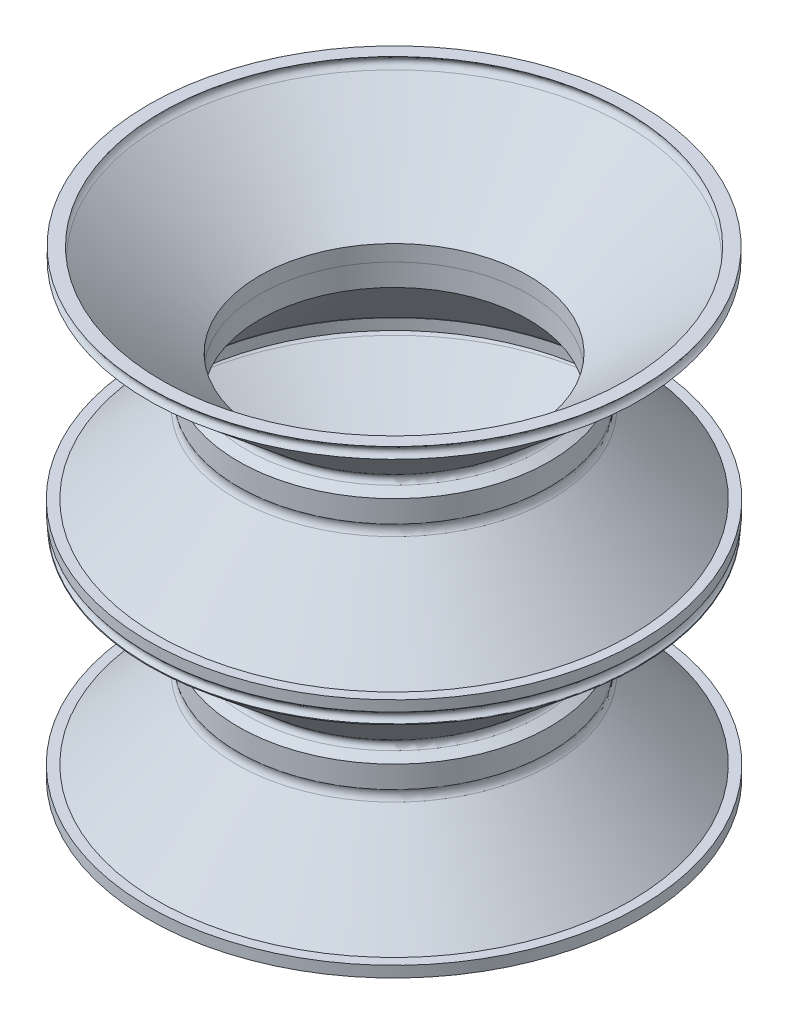
ISO-10303-21;
HEADER;
FILE_DESCRIPTION(('STEP AP214'),'2;1');
FILE_NAME('part.step','',(''),(''),'','','');
FILE_SCHEMA(('AUTOMOTIVE_DESIGN { 1 0 10303 214 1 1 1 1 }'));
ENDSEC;
DATA;
#1=APPLICATION_CONTEXT('core data for automotive mechanical design processes');
#2=APPLICATION_PROTOCOL_DEFINITION('international standard','automotive_design',2000,#1);
#3=PRODUCT_CONTEXT('',#1,'mechanical');
#4=PRODUCT('Part','Part','',(#3));
#5=PRODUCT_RELATED_PRODUCT_CATEGORY('part','',(#4));
#6=PRODUCT_DEFINITION_FORMATION('','',#4);
#7=PRODUCT_DEFINITION_CONTEXT('part definition',#1,'design');
#8=PRODUCT_DEFINITION('design','',#6,#7);
#9=PRODUCT_DEFINITION_SHAPE('','',#8);
#10=(LENGTH_UNIT() NAMED_UNIT(*) SI_UNIT(.MILLI.,.METRE.));
#11=(NAMED_UNIT(*) PLANE_ANGLE_UNIT() SI_UNIT($,.RADIAN.));
#12=(NAMED_UNIT(*) SI_UNIT($,.STERADIAN.) SOLID_ANGLE_UNIT());
#13=UNCERTAINTY_MEASURE_WITH_UNIT(LENGTH_MEASURE(1.E-05),#10,'distance_accuracy_value','');
#14=(GEOMETRIC_REPRESENTATION_CONTEXT(3) GLOBAL_UNCERTAINTY_ASSIGNED_CONTEXT((#13)) GLOBAL_UNIT_ASSIGNED_CONTEXT((#10,
#11,#12)) REPRESENTATION_CONTEXT('',''));
#15=CARTESIAN_POINT('',(0.,0.,0.));
#16=DIRECTION('',(0.,0.,1.));
#17=DIRECTION('',(1.,0.,0.));
#18=AXIS2_PLACEMENT_3D('',#15,#16,#17);
#19=CARTESIAN_POINT('',(12.266246150267,20.84,0.));
#20=DIRECTION('',(0.,-1.,0.));
#21=DIRECTION('',(1.,0.,0.));
#22=AXIS2_PLACEMENT_3D('',#19,#20,#21);
#23=CONICAL_SURFACE('',#22,12.7105503207346,1.02390555454664);
#24=CARTESIAN_POINT('',(12.266246150267,20.4777114557299,0.));
#25=DIRECTION('',(0.,-1.,0.));
#26=DIRECTION('',(1.,0.,0.));
#27=AXIS2_PLACEMENT_3D('',#24,#25,#26);
#28=CIRCLE('',#27,13.3056020683309);
#29=CARTESIAN_POINT('',(25.5718482185979,20.4777114557299,0.));
#30=VERTEX_POINT('',#29);
#31=EDGE_CURVE('E11',#30,#30,#28,.T.);
#32=ORIENTED_EDGE('',*,*,#31,.T.);
#33=EDGE_LOOP('',(#32));
#34=FACE_BOUND('',#33,.T.);
#35=CARTESIAN_POINT('',(12.266246150267,19.9918152658715,0.));
#36=DIRECTION('',(0.,1.,0.));
#37=DIRECTION('',(-1.,0.,0.));
#38=AXIS2_PLACEMENT_3D('',#35,#36,#37);
#39=CIRCLE('',#38,14.1036769219207);
#40=CARTESIAN_POINT('',(-1.83743077165368,19.9918152658715,0.));
#41=VERTEX_POINT('',#40);
#42=EDGE_CURVE('E77',#41,#41,#39,.T.);
#43=ORIENTED_EDGE('',*,*,#42,.T.);
#44=EDGE_LOOP('',(#43));
#45=FACE_BOUND('',#44,.T.);
#46=ADVANCED_FACE('F54',(#34,#45),#23,.T.);
#47=CARTESIAN_POINT('',(12.266246150267,28.84,0.));
#48=DIRECTION('',(0.,1.,0.));
#49=DIRECTION('',(-1.,0.,0.));
#50=AXIS2_PLACEMENT_3D('',#47,#48,#49);
#51=CONICAL_SURFACE('',#50,22.2445790614883,0.87266462599717);
#52=CARTESIAN_POINT('',(12.266246150267,21.2878064534284,0.));
#53=DIRECTION('',(0.,1.,0.));
#54=DIRECTION('',(-1.,0.,0.));
#55=AXIS2_PLACEMENT_3D('',#52,#53,#54);
#56=CIRCLE('',#55,13.2442252703947);
#57=CARTESIAN_POINT('',(-0.977979120127719,21.2878064534284,0.));
#58=VERTEX_POINT('',#57);
#59=EDGE_CURVE('E61',#58,#58,#56,.T.);
#60=ORIENTED_EDGE('',*,*,#59,.T.);
#61=EDGE_LOOP('',(#60));
#62=FACE_BOUND('',#61,.T.);
#63=CARTESIAN_POINT('',(12.266246150267,28.84,0.));
#64=DIRECTION('',(0.,1.,0.));
#65=DIRECTION('',(-1.,0.,0.));
#66=AXIS2_PLACEMENT_3D('',#63,#64,#65);
#67=CIRCLE('',#66,22.2445790614883);
#68=CARTESIAN_POINT('',(-9.97833291122136,28.84,0.));
#69=VERTEX_POINT('',#68);
#70=EDGE_CURVE('E65',#69,#69,#67,.T.);
#71=ORIENTED_EDGE('',*,*,#70,.F.);
#72=EDGE_LOOP('',(#71));
#73=FACE_BOUND('',#72,.T.);
#74=ADVANCED_FACE('F123',(#62,#73),#51,.T.);
#75=CARTESIAN_POINT('',(12.266246150267,21.4397502558786,0.));
#76=DIRECTION('',(0.,1.,0.));
#77=DIRECTION('',(-1.,0.,0.));
#78=AXIS2_PLACEMENT_3D('',#75,#76,#77);
#79=CONICAL_SURFACE('',#78,12.1807257813488,0.87266462599717);
#80=CARTESIAN_POINT('',(12.266246150267,28.84,0.));
#81=DIRECTION('',(0.,-1.,0.));
#82=DIRECTION('',(1.,0.,0.));
#83=AXIS2_PLACEMENT_3D('',#80,#81,#82);
#84=CIRCLE('',#83,21.);
#85=CARTESIAN_POINT('',(33.266246150267,28.84,0.));
#86=VERTEX_POINT('',#85);
#87=EDGE_CURVE('E86',#86,#86,#84,.T.);
#88=ORIENTED_EDGE('',*,*,#87,.F.);
#89=EDGE_LOOP('',(#88));
#90=FACE_BOUND('',#89,.T.);
#91=CARTESIAN_POINT('',(12.266246150267,21.4397502558786,0.));
#92=DIRECTION('',(0.,1.,0.));
#93=DIRECTION('',(-1.,0.,0.));
#94=AXIS2_PLACEMENT_3D('',#91,#92,#93);
#95=CIRCLE('',#94,12.1807257813488);
#96=CARTESIAN_POINT('',(0.0855203689181672,21.4397502558786,0.));
#97=VERTEX_POINT('',#96);
#98=EDGE_CURVE('E69',#97,#97,#95,.T.);
#99=ORIENTED_EDGE('',*,*,#98,.F.);
#100=EDGE_LOOP('',(#99));
#101=FACE_BOUND('',#100,.T.);
#102=ADVANCED_FACE('F119',(#90,#101),#79,.F.);
#103=CARTESIAN_POINT('',(12.266246150267,28.4490180328199,0.));
#104=DIRECTION('',(0.,1.,0.));
#105=DIRECTION('',(-1.,0.,0.));
#106=AXIS2_PLACEMENT_3D('',#103,#104,#105);
#107=CYLINDRICAL_SURFACE('',#106,12.1807257813488);
#108=ORIENTED_EDGE('',*,*,#98,.T.);
#109=EDGE_LOOP('',(#108));
#110=FACE_BOUND('',#109,.T.);
#111=CARTESIAN_POINT('',(12.266246150267,19.9918152658715,0.));
#112=DIRECTION('',(0.,1.,0.));
#113=DIRECTION('',(-1.,0.,0.));
#114=AXIS2_PLACEMENT_3D('',#111,#112,#113);
#115=CIRCLE('',#114,12.1807257813488);
#116=CARTESIAN_POINT('',(0.0855203689181672,19.9918152658715,0.));
#117=VERTEX_POINT('',#116);
#118=EDGE_CURVE('E74',#117,#117,#115,.T.);
#119=ORIENTED_EDGE('',*,*,#118,.F.);
#120=EDGE_LOOP('',(#119));
#121=FACE_BOUND('',#120,.T.);
#122=ADVANCED_FACE('F115',(#110,#121),#107,.F.);
#123=CARTESIAN_POINT('',(0.0855203689181681,19.9918152658715,0.));
#124=DIRECTION('',(0.,-1.,0.));
#125=DIRECTION('',(1.,0.,0.));
#126=AXIS2_PLACEMENT_3D('',#123,#124,#125);
#127=PLANE('',#126);
#128=ORIENTED_EDGE('',*,*,#118,.T.);
#129=EDGE_LOOP('',(#128));
#130=FACE_BOUND('',#129,.T.);
#131=ORIENTED_EDGE('',*,*,#42,.F.);
#132=EDGE_LOOP('',(#131));
#133=FACE_BOUND('',#132,.T.);
#134=ADVANCED_FACE('F112',(#130,#133),#127,.T.);
#135=CARTESIAN_POINT('',(12.266246150267,20.9047842318689,0.));
#136=DIRECTION('',(0.,1.,0.));
#137=DIRECTION('',(-1.,0.,0.));
#138=AXIS2_PLACEMENT_3D('',#135,#136,#137);
#139=TOROIDAL_SURFACE('',#138,13.565619075238,0.5);
#140=ORIENTED_EDGE('',*,*,#31,.F.);
#141=EDGE_LOOP('',(#140));
#142=FACE_BOUND('',#141,.T.);
#143=ORIENTED_EDGE('',*,*,#59,.F.);
#144=EDGE_LOOP('',(#143));
#145=FACE_BOUND('',#144,.T.);
#146=ADVANCED_FACE('F56',(#142,#145),#139,.F.);
#147=CARTESIAN_POINT('',(-8.73375384973302,28.84,0.));
#148=CARTESIAN_POINT('',(-9.41713424360817,29.2947580248928,0.));
#149=CARTESIAN_POINT('',(-8.79657882871846,29.84,0.));
#150=B_SPLINE_CURVE_WITH_KNOTS('',2,(#147,#148,#149),.UNSPECIFIED.,.F.,.F.,(3,3),(0.,1.),.UNSPECIFIED.);
#151=CARTESIAN_POINT('',(12.266246150267,0.870155669747817,0.));
#152=DIRECTION('',(0.,-1.,0.));
#153=AXIS1_PLACEMENT('',#151,#152);
#154=SURFACE_OF_REVOLUTION('',#150,#153);
#155=CARTESIAN_POINT('',(12.266246150267,29.84,0.));
#156=DIRECTION('',(0.,-1.,0.));
#157=DIRECTION('',(1.,0.,0.));
#158=AXIS2_PLACEMENT_3D('',#155,#156,#157);
#159=CIRCLE('',#158,21.0628249789854);
#160=CARTESIAN_POINT('',(33.3290711292524,29.84,0.));
#161=VERTEX_POINT('',#160);
#162=EDGE_CURVE('E80',#161,#161,#159,.T.);
#163=ORIENTED_EDGE('',*,*,#162,.F.);
#164=EDGE_LOOP('',(#163));
#165=FACE_BOUND('',#164,.T.);
#166=ORIENTED_EDGE('',*,*,#87,.T.);
#167=EDGE_LOOP('',(#166));
#168=FACE_BOUND('',#167,.T.);
#169=ADVANCED_FACE('F107',(#165,#168),#154,.T.);
#170=CARTESIAN_POINT('',(-8.79657882871846,29.84,0.));
#171=DIRECTION('',(0.,-1.,0.));
#172=DIRECTION('',(1.,0.,0.));
#173=AXIS2_PLACEMENT_3D('',#170,#171,#172);
#174=PLANE('',#173);
#175=CARTESIAN_POINT('',(12.266246150267,29.84,0.));
#176=DIRECTION('',(0.,-1.,0.));
#177=DIRECTION('',(1.,0.,0.));
#178=AXIS2_PLACEMENT_3D('',#175,#176,#177);
#179=CIRCLE('',#178,22.2445790614883);
#180=CARTESIAN_POINT('',(34.5108252117553,29.84,0.));
#181=VERTEX_POINT('',#180);
#182=EDGE_CURVE('E83',#181,#181,#179,.T.);
#183=ORIENTED_EDGE('',*,*,#182,.F.);
#184=EDGE_LOOP('',(#183));
#185=FACE_BOUND('',#184,.T.);
#186=ORIENTED_EDGE('',*,*,#162,.T.);
#187=EDGE_LOOP('',(#186));
#188=FACE_BOUND('',#187,.T.);
#189=ADVANCED_FACE('F103',(#185,#188),#174,.F.);
#190=CARTESIAN_POINT('',(-9.97833291122136,29.84,0.));
#191=CARTESIAN_POINT('',(-9.32229251414753,29.3233569168223,0.));
#192=CARTESIAN_POINT('',(-9.97833291122136,28.84,0.));
#193=B_SPLINE_CURVE_WITH_KNOTS('',2,(#190,#191,#192),.UNSPECIFIED.,.F.,.F.,(3,3),(0.,1.),.UNSPECIFIED.);
#194=CARTESIAN_POINT('',(12.266246150267,0.870155669747817,0.));
#195=DIRECTION('',(0.,-1.,0.));
#196=AXIS1_PLACEMENT('',#194,#195);
#197=SURFACE_OF_REVOLUTION('',#193,#196);
#198=ORIENTED_EDGE('',*,*,#70,.T.);
#199=EDGE_LOOP('',(#198));
#200=FACE_BOUND('',#199,.T.);
#201=ORIENTED_EDGE('',*,*,#182,.T.);
#202=EDGE_LOOP('',(#201));
#203=FACE_BOUND('',#202,.T.);
#204=ADVANCED_FACE('F100',(#200,#203),#197,.T.);
#205=CLOSED_SHELL('',(#46,#74,#102,#122,#134,#146,#169,#189,#204));
#206=MANIFOLD_SOLID_BREP('B2',#205);
#207=CARTESIAN_POINT('',(12.266246150267,19.9918152658715,0.));
#208=DIRECTION('',(0.,-1.,0.));
#209=DIRECTION('',(1.,0.,0.));
#210=AXIS2_PLACEMENT_3D('',#207,#208,#209);
#211=PLANE('',#210);
#212=CARTESIAN_POINT('',(12.266246150267,19.9918152658715,0.));
#213=DIRECTION('',(0.,-1.,0.));
#214=DIRECTION('',(1.,0.,0.));
#215=AXIS2_PLACEMENT_3D('',#212,#213,#214);
#216=CIRCLE('',#215,14.1036769219207);
#217=CARTESIAN_POINT('',(26.3699230721876,19.9918152658715,0.));
#218=VERTEX_POINT('',#217);
#219=EDGE_CURVE('E231',#218,#218,#216,.T.);
#220=ORIENTED_EDGE('',*,*,#219,.F.);
#221=EDGE_LOOP('',(#220));
#222=FACE_BOUND('',#221,.T.);
#223=CARTESIAN_POINT('',(12.266246150267,19.9918152658715,0.));
#224=DIRECTION('',(0.,-1.,0.));
#225=DIRECTION('',(1.,0.,0.));
#226=AXIS2_PLACEMENT_3D('',#223,#224,#225);
#227=CIRCLE('',#226,12.1807257813488);
#228=CARTESIAN_POINT('',(24.4469719316158,19.9918152658715,0.));
#229=VERTEX_POINT('',#228);
#230=EDGE_CURVE('E234',#229,#229,#227,.T.);
#231=ORIENTED_EDGE('',*,*,#230,.T.);
#232=EDGE_LOOP('',(#231));
#233=FACE_BOUND('',#232,.T.);
#234=ADVANCED_FACE('F213',(#222,#233),#211,.F.);
#235=CARTESIAN_POINT('',(12.266246150267,17.9918152658715,0.));
#236=DIRECTION('',(0.,1.,0.));
#237=DIRECTION('',(-1.,0.,0.));
#238=AXIS2_PLACEMENT_3D('',#235,#236,#237);
#239=CYLINDRICAL_SURFACE('',#238,14.1036769219207);
#240=CARTESIAN_POINT('',(12.266246150267,17.9918152658715,0.));
#241=DIRECTION('',(0.,-1.,0.));
#242=DIRECTION('',(1.,0.,0.));
#243=AXIS2_PLACEMENT_3D('',#240,#241,#242);
#244=CIRCLE('',#243,14.1036769219207);
#245=CARTESIAN_POINT('',(26.3699230721876,17.9918152658715,0.));
#246=VERTEX_POINT('',#245);
#247=EDGE_CURVE('E228',#246,#246,#244,.T.);
#248=ORIENTED_EDGE('',*,*,#247,.F.);
#249=EDGE_LOOP('',(#248));
#250=FACE_BOUND('',#249,.T.);
#251=ORIENTED_EDGE('',*,*,#219,.T.);
#252=EDGE_LOOP('',(#251));
#253=FACE_BOUND('',#252,.T.);
#254=ADVANCED_FACE('F279',(#250,#253),#239,.T.);
#255=CARTESIAN_POINT('',(12.266246150267,17.9918152658715,0.));
#256=DIRECTION('',(0.,1.,0.));
#257=DIRECTION('',(-1.,0.,0.));
#258=AXIS2_PLACEMENT_3D('',#255,#256,#257);
#259=CYLINDRICAL_SURFACE('',#258,12.1807257813488);
#260=CARTESIAN_POINT('',(12.266246150267,17.9918152658715,0.));
#261=DIRECTION('',(0.,-1.,0.));
#262=DIRECTION('',(1.,0.,0.));
#263=AXIS2_PLACEMENT_3D('',#260,#261,#262);
#264=CIRCLE('',#263,12.1807257813488);
#265=CARTESIAN_POINT('',(24.4469719316158,17.9918152658715,0.));
#266=VERTEX_POINT('',#265);
#267=EDGE_CURVE('E242',#266,#266,#264,.T.);
#268=ORIENTED_EDGE('',*,*,#267,.T.);
#269=EDGE_LOOP('',(#268));
#270=FACE_BOUND('',#269,.T.);
#271=ORIENTED_EDGE('',*,*,#230,.F.);
#272=EDGE_LOOP('',(#271));
#273=FACE_BOUND('',#272,.T.);
#274=ADVANCED_FACE('F285',(#270,#273),#259,.F.);
#275=CARTESIAN_POINT('',(12.266246150267,17.9918152658715,0.));
#276=DIRECTION('',(0.,-1.,0.));
#277=DIRECTION('',(1.,0.,0.));
#278=AXIS2_PLACEMENT_3D('',#275,#276,#277);
#279=CONICAL_SURFACE('',#278,13.4252337162371,0.785398163397447);
#280=CARTESIAN_POINT('',(12.266246150267,17.1342172194325,0.));
#281=DIRECTION('',(0.,1.,0.));
#282=DIRECTION('',(-1.,0.,0.));
#283=AXIS2_PLACEMENT_3D('',#280,#281,#282);
#284=CIRCLE('',#283,14.2828317626761);
#285=CARTESIAN_POINT('',(-2.01658561240909,17.1342172194325,0.));
#286=VERTEX_POINT('',#285);
#287=EDGE_CURVE('E224',#286,#286,#284,.F.);
#288=ORIENTED_EDGE('',*,*,#287,.T.);
#289=EDGE_LOOP('',(#288));
#290=FACE_BOUND('',#289,.T.);
#291=CARTESIAN_POINT('',(12.266246150267,9.99181526587148,0.));
#292=DIRECTION('',(0.,-1.,0.));
#293=DIRECTION('',(1.,0.,0.));
#294=AXIS2_PLACEMENT_3D('',#291,#292,#293);
#295=CIRCLE('',#294,21.4252337162371);
#296=CARTESIAN_POINT('',(33.6914798665041,9.99181526587148,0.));
#297=VERTEX_POINT('',#296);
#298=EDGE_CURVE('E239',#297,#297,#295,.T.);
#299=ORIENTED_EDGE('',*,*,#298,.F.);
#300=EDGE_LOOP('',(#299));
#301=FACE_BOUND('',#300,.T.);
#302=ADVANCED_FACE('F298',(#290,#301),#279,.T.);
#303=CARTESIAN_POINT('',(12.266246150267,9.99181526587148,0.));
#304=DIRECTION('',(0.,-1.,0.));
#305=DIRECTION('',(1.,0.,0.));
#306=AXIS2_PLACEMENT_3D('',#303,#304,#305);
#307=CONICAL_SURFACE('',#306,20.1807257813488,0.785398163397447);
#308=ORIENTED_EDGE('',*,*,#267,.F.);
#309=EDGE_LOOP('',(#308));
#310=FACE_BOUND('',#309,.T.);
#311=CARTESIAN_POINT('',(12.266246150267,9.99181526587148,0.));
#312=DIRECTION('',(0.,-1.,0.));
#313=DIRECTION('',(1.,0.,0.));
#314=AXIS2_PLACEMENT_3D('',#311,#312,#313);
#315=CIRCLE('',#314,20.1807257813488);
#316=CARTESIAN_POINT('',(32.4469719316158,9.99181526587148,0.));
#317=VERTEX_POINT('',#316);
#318=EDGE_CURVE('E243',#317,#317,#315,.T.);
#319=ORIENTED_EDGE('',*,*,#318,.T.);
#320=EDGE_LOOP('',(#319));
#321=FACE_BOUND('',#320,.T.);
#322=ADVANCED_FACE('F293',(#310,#321),#307,.F.);
#323=CARTESIAN_POINT('',(12.266246150267,17.6999026443818,0.));
#324=DIRECTION('',(0.,1.,0.));
#325=DIRECTION('',(-1.,0.,0.));
#326=AXIS2_PLACEMENT_3D('',#323,#324,#325);
#327=TOROIDAL_SURFACE('',#326,14.8485171876253,0.8);
#328=ORIENTED_EDGE('',*,*,#247,.T.);
#329=EDGE_LOOP('',(#328));
#330=FACE_BOUND('',#329,.T.);
#331=ORIENTED_EDGE('',*,*,#287,.F.);
#332=EDGE_LOOP('',(#331));
#333=FACE_BOUND('',#332,.T.);
#334=ADVANCED_FACE('F275',(#330,#333),#327,.F.);
#335=CARTESIAN_POINT('',(12.266246150267,9.99181526587148,0.));
#336=DIRECTION('',(0.,-1.,0.));
#337=DIRECTION('',(1.,0.,0.));
#338=AXIS2_PLACEMENT_3D('',#335,#336,#337);
#339=PLANE('',#338);
#340=CARTESIAN_POINT('',(12.266246150267,9.99181526587148,0.));
#341=DIRECTION('',(0.,-1.,0.));
#342=DIRECTION('',(1.,0.,0.));
#343=AXIS2_PLACEMENT_3D('',#340,#341,#342);
#344=CIRCLE('',#343,20.1307257813488);
#345=CARTESIAN_POINT('',(32.3969719316158,9.99181526587148,0.));
#346=VERTEX_POINT('',#345);
#347=EDGE_CURVE('E252',#346,#346,#344,.T.);
#348=ORIENTED_EDGE('',*,*,#347,.T.);
#349=EDGE_LOOP('',(#348));
#350=FACE_BOUND('',#349,.T.);
#351=ORIENTED_EDGE('',*,*,#318,.F.);
#352=EDGE_LOOP('',(#351));
#353=FACE_BOUND('',#352,.T.);
#354=ADVANCED_FACE('F264',(#350,#353),#339,.F.);
#355=CARTESIAN_POINT('',(12.266246150267,8.99181526587148,0.));
#356=DIRECTION('',(0.,-1.,0.));
#357=DIRECTION('',(1.,0.,0.));
#358=AXIS2_PLACEMENT_3D('',#355,#356,#357);
#359=PLANE('',#358);
#360=CARTESIAN_POINT('',(12.266246150267,8.99181526587148,0.));
#361=DIRECTION('',(0.,-1.,0.));
#362=DIRECTION('',(1.,0.,0.));
#363=AXIS2_PLACEMENT_3D('',#360,#361,#362);
#364=CIRCLE('',#363,22.2445790614883);
#365=CARTESIAN_POINT('',(34.5108252117553,8.99181526587148,0.));
#366=VERTEX_POINT('',#365);
#367=EDGE_CURVE('E220',#366,#366,#364,.T.);
#368=ORIENTED_EDGE('',*,*,#367,.T.);
#369=EDGE_LOOP('',(#368));
#370=FACE_BOUND('',#369,.T.);
#371=CARTESIAN_POINT('',(12.266246150267,8.99181526587148,0.));
#372=DIRECTION('',(0.,-1.,0.));
#373=DIRECTION('',(1.,0.,0.));
#374=AXIS2_PLACEMENT_3D('',#371,#372,#373);
#375=CIRCLE('',#374,20.1307257813488);
#376=CARTESIAN_POINT('',(32.3969719316158,8.99181526587148,0.));
#377=VERTEX_POINT('',#376);
#378=EDGE_CURVE('E251',#377,#377,#375,.T.);
#379=ORIENTED_EDGE('',*,*,#378,.F.);
#380=EDGE_LOOP('',(#379));
#381=FACE_BOUND('',#380,.T.);
#382=ADVANCED_FACE('F261',(#370,#381),#359,.T.);
#383=ORIENTED_EDGE('',*,*,#298,.T.);
#384=EDGE_LOOP('',(#383));
#385=FACE_BOUND('',#384,.T.);
#386=CARTESIAN_POINT('',(12.266246150267,9.99181526587148,0.));
#387=DIRECTION('',(0.,-1.,0.));
#388=DIRECTION('',(1.,0.,0.));
#389=AXIS2_PLACEMENT_3D('',#386,#387,#388);
#390=CIRCLE('',#389,22.2945790614883);
#391=CARTESIAN_POINT('',(34.5608252117553,9.99181526587148,0.));
#392=VERTEX_POINT('',#391);
#393=EDGE_CURVE('E246',#392,#392,#390,.T.);
#394=ORIENTED_EDGE('',*,*,#393,.F.);
#395=EDGE_LOOP('',(#394));
#396=FACE_BOUND('',#395,.T.);
#397=ADVANCED_FACE('F263',(#385,#396),#339,.F.);
#398=CARTESIAN_POINT('',(12.266246150267,8.99181526587148,0.));
#399=DIRECTION('',(0.,1.,0.));
#400=DIRECTION('',(-1.,0.,0.));
#401=AXIS2_PLACEMENT_3D('',#398,#399,#400);
#402=CYLINDRICAL_SURFACE('',#401,22.2945790614883);
#403=CARTESIAN_POINT('',(12.266246150267,9.04181526587148,0.));
#404=DIRECTION('',(0.,-1.,0.));
#405=DIRECTION('',(1.,0.,0.));
#406=AXIS2_PLACEMENT_3D('',#403,#404,#405);
#407=CIRCLE('',#406,22.2945790614883);
#408=CARTESIAN_POINT('',(34.5608252117553,9.04181526587148,0.));
#409=VERTEX_POINT('',#408);
#410=EDGE_CURVE('E53',#409,#409,#407,.F.);
#411=ORIENTED_EDGE('',*,*,#410,.T.);
#412=EDGE_LOOP('',(#411));
#413=FACE_BOUND('',#412,.T.);
#414=ORIENTED_EDGE('',*,*,#393,.T.);
#415=EDGE_LOOP('',(#414));
#416=FACE_BOUND('',#415,.T.);
#417=ADVANCED_FACE('F271',(#413,#416),#402,.T.);
#418=CARTESIAN_POINT('',(12.266246150267,8.99181526587148,0.));
#419=DIRECTION('',(0.,1.,0.));
#420=DIRECTION('',(-1.,0.,0.));
#421=AXIS2_PLACEMENT_3D('',#418,#419,#420);
#422=CYLINDRICAL_SURFACE('',#421,20.1307257813488);
#423=ORIENTED_EDGE('',*,*,#378,.T.);
#424=EDGE_LOOP('',(#423));
#425=FACE_BOUND('',#424,.T.);
#426=ORIENTED_EDGE('',*,*,#347,.F.);
#427=EDGE_LOOP('',(#426));
#428=FACE_BOUND('',#427,.T.);
#429=ADVANCED_FACE('F258',(#425,#428),#422,.F.);
#430=CARTESIAN_POINT('',(12.266246150267,9.04181526587148,0.));
#431=DIRECTION('',(0.,-1.,0.));
#432=DIRECTION('',(1.,0.,0.));
#433=AXIS2_PLACEMENT_3D('',#430,#431,#432);
#434=TOROIDAL_SURFACE('',#433,22.2445790614883,0.05);
#435=ORIENTED_EDGE('',*,*,#410,.F.);
#436=EDGE_LOOP('',(#435));
#437=FACE_BOUND('',#436,.T.);
#438=ORIENTED_EDGE('',*,*,#367,.F.);
#439=EDGE_LOOP('',(#438));
#440=FACE_BOUND('',#439,.T.);
#441=ADVANCED_FACE('F215',(#437,#440),#434,.T.);
#442=CLOSED_SHELL('',(#234,#254,#274,#302,#322,#334,#354,#382,#397,#417,#429,#441));
#443=MANIFOLD_SOLID_BREP('B6',#442);
#444=CARTESIAN_POINT('',(12.266246150267,-0.84818473412852,0.));
#445=DIRECTION('',(0.,-1.,0.));
#446=DIRECTION('',(1.,0.,0.));
#447=AXIS2_PLACEMENT_3D('',#444,#445,#446);
#448=PLANE('',#447);
#449=CARTESIAN_POINT('',(12.266246150267,-0.84818473412852,0.));
#450=DIRECTION('',(0.,-1.,0.));
#451=DIRECTION('',(1.,0.,0.));
#452=AXIS2_PLACEMENT_3D('',#449,#450,#451);
#453=CIRCLE('',#452,14.1036769219207);
#454=CARTESIAN_POINT('',(26.3699230721876,-0.848184734128518,0.));
#455=VERTEX_POINT('',#454);
#456=EDGE_CURVE('E414',#455,#455,#453,.T.);
#457=ORIENTED_EDGE('',*,*,#456,.F.);
#458=EDGE_LOOP('',(#457));
#459=FACE_BOUND('',#458,.T.);
#460=CARTESIAN_POINT('',(12.266246150267,-0.84818473412852,0.));
#461=DIRECTION('',(0.,-1.,0.));
#462=DIRECTION('',(1.,0.,0.));
#463=AXIS2_PLACEMENT_3D('',#460,#461,#462);
#464=CIRCLE('',#463,12.1807257813488);
#465=CARTESIAN_POINT('',(24.4469719316158,-0.848184734128518,0.));
#466=VERTEX_POINT('',#465);
#467=EDGE_CURVE('E420',#466,#466,#464,.T.);
#468=ORIENTED_EDGE('',*,*,#467,.T.);
#469=EDGE_LOOP('',(#468));
#470=FACE_BOUND('',#469,.T.);
#471=ADVANCED_FACE('F401',(#459,#470),#448,.F.);
#472=CARTESIAN_POINT('',(12.266246150267,-2.84818473412852,0.));
#473=DIRECTION('',(0.,1.,0.));
#474=DIRECTION('',(-1.,0.,0.));
#475=AXIS2_PLACEMENT_3D('',#472,#473,#474);
#476=CYLINDRICAL_SURFACE('',#475,14.1036769219207);
#477=CARTESIAN_POINT('',(12.266246150267,-2.84818473412852,0.));
#478=DIRECTION('',(0.,-1.,0.));
#479=DIRECTION('',(1.,0.,0.));
#480=AXIS2_PLACEMENT_3D('',#477,#478,#479);
#481=CIRCLE('',#480,14.1036769219207);
#482=CARTESIAN_POINT('',(26.3699230721876,-2.84818473412852,0.));
#483=VERTEX_POINT('',#482);
#484=EDGE_CURVE('E409',#483,#483,#481,.T.);
#485=ORIENTED_EDGE('',*,*,#484,.F.);
#486=EDGE_LOOP('',(#485));
#487=FACE_BOUND('',#486,.T.);
#488=ORIENTED_EDGE('',*,*,#456,.T.);
#489=EDGE_LOOP('',(#488));
#490=FACE_BOUND('',#489,.T.);
#491=ADVANCED_FACE('F473',(#487,#490),#476,.T.);
#492=CARTESIAN_POINT('',(12.266246150267,-2.84818473412852,0.));
#493=DIRECTION('',(0.,1.,0.));
#494=DIRECTION('',(-1.,0.,0.));
#495=AXIS2_PLACEMENT_3D('',#492,#493,#494);
#496=CYLINDRICAL_SURFACE('',#495,12.1807257813488);
#497=CARTESIAN_POINT('',(12.266246150267,-2.84818473412852,0.));
#498=DIRECTION('',(0.,-1.,0.));
#499=DIRECTION('',(1.,0.,0.));
#500=AXIS2_PLACEMENT_3D('',#497,#498,#499);
#501=CIRCLE('',#500,12.1807257813488);
#502=CARTESIAN_POINT('',(24.4469719316158,-2.84818473412852,0.));
#503=VERTEX_POINT('',#502);
#504=EDGE_CURVE('E429',#503,#503,#501,.T.);
#505=ORIENTED_EDGE('',*,*,#504,.T.);
#506=EDGE_LOOP('',(#505));
#507=FACE_BOUND('',#506,.T.);
#508=ORIENTED_EDGE('',*,*,#467,.F.);
#509=EDGE_LOOP('',(#508));
#510=FACE_BOUND('',#509,.T.);
#511=ADVANCED_FACE('F479',(#507,#510),#496,.F.);
#512=CARTESIAN_POINT('',(12.266246150267,-2.84818473412852,0.));
#513=DIRECTION('',(0.,-1.,0.));
#514=DIRECTION('',(1.,0.,0.));
#515=AXIS2_PLACEMENT_3D('',#512,#513,#514);
#516=CONICAL_SURFACE('',#515,13.4252337162371,0.785398163397447);
#517=CARTESIAN_POINT('',(12.266246150267,-3.70578278056746,0.));
#518=DIRECTION('',(0.,1.,0.));
#519=DIRECTION('',(-1.,0.,0.));
#520=AXIS2_PLACEMENT_3D('',#517,#518,#519);
#521=CIRCLE('',#520,14.2828317626761);
#522=CARTESIAN_POINT('',(-2.01658561240909,-3.70578278056746,0.));
#523=VERTEX_POINT('',#522);
#524=EDGE_CURVE('E212',#523,#523,#521,.F.);
#525=ORIENTED_EDGE('',*,*,#524,.T.);
#526=EDGE_LOOP('',(#525));
#527=FACE_BOUND('',#526,.T.);
#528=CARTESIAN_POINT('',(12.266246150267,-10.8481847341285,0.));
#529=DIRECTION('',(0.,-1.,0.));
#530=DIRECTION('',(1.,0.,0.));
#531=AXIS2_PLACEMENT_3D('',#528,#529,#530);
#532=CIRCLE('',#531,21.4252337162371);
#533=CARTESIAN_POINT('',(33.6914798665041,-10.8481847341285,0.));
#534=VERTEX_POINT('',#533);
#535=EDGE_CURVE('E425',#534,#534,#532,.T.);
#536=ORIENTED_EDGE('',*,*,#535,.F.);
#537=EDGE_LOOP('',(#536));
#538=FACE_BOUND('',#537,.T.);
#539=ADVANCED_FACE('F486',(#527,#538),#516,.T.);
#540=CARTESIAN_POINT('',(12.266246150267,-10.8481847341285,0.));
#541=DIRECTION('',(0.,-1.,0.));
#542=DIRECTION('',(1.,0.,0.));
#543=AXIS2_PLACEMENT_3D('',#540,#541,#542);
#544=CONICAL_SURFACE('',#543,20.1807257813488,0.785398163397447);
#545=ORIENTED_EDGE('',*,*,#504,.F.);
#546=EDGE_LOOP('',(#545));
#547=FACE_BOUND('',#546,.T.);
#548=CARTESIAN_POINT('',(12.266246150267,-10.8481847341285,0.));
#549=DIRECTION('',(0.,-1.,0.));
#550=DIRECTION('',(1.,0.,0.));
#551=AXIS2_PLACEMENT_3D('',#548,#549,#550);
#552=CIRCLE('',#551,20.1807257813488);
#553=CARTESIAN_POINT('',(32.4469719316158,-10.8481847341285,0.));
#554=VERTEX_POINT('',#553);
#555=EDGE_CURVE('E430',#554,#554,#552,.T.);
#556=ORIENTED_EDGE('',*,*,#555,.T.);
#557=EDGE_LOOP('',(#556));
#558=FACE_BOUND('',#557,.T.);
#559=ADVANCED_FACE('F490',(#547,#558),#544,.F.);
#560=CARTESIAN_POINT('',(12.266246150267,-3.14009735561822,0.));
#561=DIRECTION('',(0.,1.,0.));
#562=DIRECTION('',(-1.,0.,0.));
#563=AXIS2_PLACEMENT_3D('',#560,#561,#562);
#564=TOROIDAL_SURFACE('',#563,14.8485171876253,0.8);
#565=ORIENTED_EDGE('',*,*,#484,.T.);
#566=EDGE_LOOP('',(#565));
#567=FACE_BOUND('',#566,.T.);
#568=ORIENTED_EDGE('',*,*,#524,.F.);
#569=EDGE_LOOP('',(#568));
#570=FACE_BOUND('',#569,.T.);
#571=ADVANCED_FACE('F403',(#567,#570),#564,.F.);
#572=CARTESIAN_POINT('',(12.266246150267,-10.8481847341285,0.));
#573=DIRECTION('',(0.,-1.,0.));
#574=DIRECTION('',(1.,0.,0.));
#575=AXIS2_PLACEMENT_3D('',#572,#573,#574);
#576=PLANE('',#575);
#577=CARTESIAN_POINT('',(12.266246150267,-10.8481847341285,0.));
#578=DIRECTION('',(0.,-1.,0.));
#579=DIRECTION('',(1.,0.,0.));
#580=AXIS2_PLACEMENT_3D('',#577,#578,#579);
#581=CIRCLE('',#580,20.1307257813488);
#582=CARTESIAN_POINT('',(32.3969719316158,-10.8481847341285,0.));
#583=VERTEX_POINT('',#582);
#584=EDGE_CURVE('E446',#583,#583,#581,.T.);
#585=ORIENTED_EDGE('',*,*,#584,.T.);
#586=EDGE_LOOP('',(#585));
#587=FACE_BOUND('',#586,.T.);
#588=ORIENTED_EDGE('',*,*,#555,.F.);
#589=EDGE_LOOP('',(#588));
#590=FACE_BOUND('',#589,.T.);
#591=ADVANCED_FACE('F460',(#587,#590),#576,.F.);
#592=CARTESIAN_POINT('',(12.266246150267,-11.8481847341285,0.));
#593=DIRECTION('',(0.,-1.,0.));
#594=DIRECTION('',(1.,0.,0.));
#595=AXIS2_PLACEMENT_3D('',#592,#593,#594);
#596=PLANE('',#595);
#597=CARTESIAN_POINT('',(12.266246150267,-11.8481847341285,0.));
#598=DIRECTION('',(0.,-1.,0.));
#599=DIRECTION('',(1.,0.,0.));
#600=AXIS2_PLACEMENT_3D('',#597,#598,#599);
#601=CIRCLE('',#600,22.2945790614883);
#602=CARTESIAN_POINT('',(34.5608252117553,-11.8481847341285,0.));
#603=VERTEX_POINT('',#602);
#604=EDGE_CURVE('E434',#603,#603,#601,.T.);
#605=ORIENTED_EDGE('',*,*,#604,.T.);
#606=EDGE_LOOP('',(#605));
#607=FACE_BOUND('',#606,.T.);
#608=CARTESIAN_POINT('',(12.266246150267,-11.8481847341285,0.));
#609=DIRECTION('',(0.,-1.,0.));
#610=DIRECTION('',(1.,0.,0.));
#611=AXIS2_PLACEMENT_3D('',#608,#609,#610);
#612=CIRCLE('',#611,20.1307257813488);
#613=CARTESIAN_POINT('',(32.3969719316158,-11.8481847341285,0.));
#614=VERTEX_POINT('',#613);
#615=EDGE_CURVE('E442',#614,#614,#612,.T.);
#616=ORIENTED_EDGE('',*,*,#615,.F.);
#617=EDGE_LOOP('',(#616));
#618=FACE_BOUND('',#617,.T.);
#619=ADVANCED_FACE('F457',(#607,#618),#596,.T.);
#620=ORIENTED_EDGE('',*,*,#535,.T.);
#621=EDGE_LOOP('',(#620));
#622=FACE_BOUND('',#621,.T.);
#623=CARTESIAN_POINT('',(12.266246150267,-10.8481847341285,0.));
#624=DIRECTION('',(0.,-1.,0.));
#625=DIRECTION('',(1.,0.,0.));
#626=AXIS2_PLACEMENT_3D('',#623,#624,#625);
#627=CIRCLE('',#626,22.2945790614883);
#628=CARTESIAN_POINT('',(34.5608252117553,-10.8481847341285,0.));
#629=VERTEX_POINT('',#628);
#630=EDGE_CURVE('E438',#629,#629,#627,.T.);
#631=ORIENTED_EDGE('',*,*,#630,.F.);
#632=EDGE_LOOP('',(#631));
#633=FACE_BOUND('',#632,.T.);
#634=ADVANCED_FACE('F459',(#622,#633),#576,.F.);
#635=CARTESIAN_POINT('',(12.266246150267,-11.8481847341285,0.));
#636=DIRECTION('',(0.,1.,0.));
#637=DIRECTION('',(-1.,0.,0.));
#638=AXIS2_PLACEMENT_3D('',#635,#636,#637);
#639=CYLINDRICAL_SURFACE('',#638,22.2945790614883);
#640=ORIENTED_EDGE('',*,*,#604,.F.);
#641=EDGE_LOOP('',(#640));
#642=FACE_BOUND('',#641,.T.);
#643=ORIENTED_EDGE('',*,*,#630,.T.);
#644=EDGE_LOOP('',(#643));
#645=FACE_BOUND('',#644,.T.);
#646=ADVANCED_FACE('F467',(#642,#645),#639,.T.);
#647=CARTESIAN_POINT('',(12.266246150267,-11.8481847341285,0.));
#648=DIRECTION('',(0.,1.,0.));
#649=DIRECTION('',(-1.,0.,0.));
#650=AXIS2_PLACEMENT_3D('',#647,#648,#649);
#651=CYLINDRICAL_SURFACE('',#650,20.1307257813488);
#652=ORIENTED_EDGE('',*,*,#615,.T.);
#653=EDGE_LOOP('',(#652));
#654=FACE_BOUND('',#653,.T.);
#655=ORIENTED_EDGE('',*,*,#584,.F.);
#656=EDGE_LOOP('',(#655));
#657=FACE_BOUND('',#656,.T.);
#658=ADVANCED_FACE('F454',(#654,#657),#651,.F.);
#659=CLOSED_SHELL('',(#471,#491,#511,#539,#559,#571,#591,#619,#634,#646,#658));
#660=MANIFOLD_SOLID_BREP('B48',#659);
#661=CARTESIAN_POINT('',(12.266246150267,0.,0.));
#662=DIRECTION('',(0.,-1.,0.));
#663=DIRECTION('',(1.,0.,0.));
#664=AXIS2_PLACEMENT_3D('',#661,#662,#663);
#665=CONICAL_SURFACE('',#664,12.7105503207346,1.02390555454664);
#666=CARTESIAN_POINT('',(12.266246150267,-0.362288544270145,0.));
#667=DIRECTION('',(0.,-1.,0.));
#668=DIRECTION('',(1.,0.,0.));
#669=AXIS2_PLACEMENT_3D('',#666,#667,#668);
#670=CIRCLE('',#669,13.3056020683309);
#671=CARTESIAN_POINT('',(25.5718482185979,-0.362288544270144,0.));
#672=VERTEX_POINT('',#671);
#673=EDGE_CURVE('E589',#672,#672,#670,.T.);
#674=ORIENTED_EDGE('',*,*,#673,.T.);
#675=EDGE_LOOP('',(#674));
#676=FACE_BOUND('',#675,.T.);
#677=CARTESIAN_POINT('',(12.266246150267,-0.848184734128519,0.));
#678=DIRECTION('',(0.,1.,0.));
#679=DIRECTION('',(-1.,0.,0.));
#680=AXIS2_PLACEMENT_3D('',#677,#678,#679);
#681=CIRCLE('',#680,14.1036769219207);
#682=CARTESIAN_POINT('',(-1.83743077165368,-0.848184734128521,0.));
#683=VERTEX_POINT('',#682);
#684=EDGE_CURVE('E604',#683,#683,#681,.T.);
#685=ORIENTED_EDGE('',*,*,#684,.T.);
#686=EDGE_LOOP('',(#685));
#687=FACE_BOUND('',#686,.T.);
#688=ADVANCED_FACE('F578',(#676,#687),#665,.T.);
#689=CARTESIAN_POINT('',(12.266246150267,8.,0.));
#690=DIRECTION('',(0.,1.,0.));
#691=DIRECTION('',(-1.,0.,0.));
#692=AXIS2_PLACEMENT_3D('',#689,#690,#691);
#693=CONICAL_SURFACE('',#692,22.2445790614883,0.87266462599717);
#694=CARTESIAN_POINT('',(12.266246150267,7.95996199984405,0.));
#695=DIRECTION('',(0.,1.,0.));
#696=DIRECTION('',(-1.,0.,0.));
#697=AXIS2_PLACEMENT_3D('',#694,#695,#696);
#698=CIRCLE('',#697,22.1968636309622);
#699=CARTESIAN_POINT('',(-9.93061748069522,7.95996199984405,0.));
#700=VERTEX_POINT('',#699);
#701=EDGE_CURVE('E400',#700,#700,#698,.F.);
#702=ORIENTED_EDGE('',*,*,#701,.T.);
#703=EDGE_LOOP('',(#702));
#704=FACE_BOUND('',#703,.T.);
#705=CARTESIAN_POINT('',(12.266246150267,0.44780645342838,0.));
#706=DIRECTION('',(0.,1.,0.));
#707=DIRECTION('',(-1.,0.,0.));
#708=AXIS2_PLACEMENT_3D('',#705,#706,#707);
#709=CIRCLE('',#708,13.2442252703947);
#710=CARTESIAN_POINT('',(-0.977979120127719,0.447806453428379,0.));
#711=VERTEX_POINT('',#710);
#712=EDGE_CURVE('E593',#711,#711,#709,.T.);
#713=ORIENTED_EDGE('',*,*,#712,.T.);
#714=EDGE_LOOP('',(#713));
#715=FACE_BOUND('',#714,.T.);
#716=ADVANCED_FACE('F650',(#704,#715),#693,.T.);
#717=CARTESIAN_POINT('',(12.266246150267,0.599750255878579,0.));
#718=DIRECTION('',(0.,1.,0.));
#719=DIRECTION('',(-1.,0.,0.));
#720=AXIS2_PLACEMENT_3D('',#717,#718,#719);
#721=CONICAL_SURFACE('',#720,12.1807257813488,0.87266462599717);
#722=CARTESIAN_POINT('',(12.266246150267,8.,0.));
#723=DIRECTION('',(0.,-1.,0.));
#724=DIRECTION('',(1.,0.,0.));
#725=AXIS2_PLACEMENT_3D('',#722,#723,#724);
#726=CIRCLE('',#725,21.);
#727=CARTESIAN_POINT('',(33.266246150267,8.00000000000001,0.));
#728=VERTEX_POINT('',#727);
#729=EDGE_CURVE('E613',#728,#728,#726,.T.);
#730=ORIENTED_EDGE('',*,*,#729,.F.);
#731=EDGE_LOOP('',(#730));
#732=FACE_BOUND('',#731,.T.);
#733=CARTESIAN_POINT('',(12.266246150267,0.599750255878579,0.));
#734=DIRECTION('',(0.,1.,0.));
#735=DIRECTION('',(-1.,0.,0.));
#736=AXIS2_PLACEMENT_3D('',#733,#734,#735);
#737=CIRCLE('',#736,12.1807257813488);
#738=CARTESIAN_POINT('',(0.0855203689181672,0.599750255878578,0.));
#739=VERTEX_POINT('',#738);
#740=EDGE_CURVE('E598',#739,#739,#737,.T.);
#741=ORIENTED_EDGE('',*,*,#740,.F.);
#742=EDGE_LOOP('',(#741));
#743=FACE_BOUND('',#742,.T.);
#744=ADVANCED_FACE('F646',(#732,#743),#721,.F.);
#745=CARTESIAN_POINT('',(12.266246150267,7.60901803281994,0.));
#746=DIRECTION('',(0.,1.,0.));
#747=DIRECTION('',(-1.,0.,0.));
#748=AXIS2_PLACEMENT_3D('',#745,#746,#747);
#749=CYLINDRICAL_SURFACE('',#748,12.1807257813488);
#750=ORIENTED_EDGE('',*,*,#740,.T.);
#751=EDGE_LOOP('',(#750));
#752=FACE_BOUND('',#751,.T.);
#753=CARTESIAN_POINT('',(12.266246150267,-0.848184734128519,0.));
#754=DIRECTION('',(0.,1.,0.));
#755=DIRECTION('',(-1.,0.,0.));
#756=AXIS2_PLACEMENT_3D('',#753,#754,#755);
#757=CIRCLE('',#756,12.1807257813488);
#758=CARTESIAN_POINT('',(0.0855203689181672,-0.848184734128521,0.));
#759=VERTEX_POINT('',#758);
#760=EDGE_CURVE('E601',#759,#759,#757,.T.);
#761=ORIENTED_EDGE('',*,*,#760,.F.);
#762=EDGE_LOOP('',(#761));
#763=FACE_BOUND('',#762,.T.);
#764=ADVANCED_FACE('F642',(#752,#763),#749,.F.);
#765=CARTESIAN_POINT('',(0.0855203689181681,-0.848184734128521,0.));
#766=DIRECTION('',(0.,-1.,0.));
#767=DIRECTION('',(1.,0.,0.));
#768=AXIS2_PLACEMENT_3D('',#765,#766,#767);
#769=PLANE('',#768);
#770=ORIENTED_EDGE('',*,*,#760,.T.);
#771=EDGE_LOOP('',(#770));
#772=FACE_BOUND('',#771,.T.);
#773=ORIENTED_EDGE('',*,*,#684,.F.);
#774=EDGE_LOOP('',(#773));
#775=FACE_BOUND('',#774,.T.);
#776=ADVANCED_FACE('F639',(#772,#775),#769,.T.);
#777=CARTESIAN_POINT('',(12.266246150267,0.0647842318688887,0.));
#778=DIRECTION('',(0.,1.,0.));
#779=DIRECTION('',(-1.,0.,0.));
#780=AXIS2_PLACEMENT_3D('',#777,#778,#779);
#781=TOROIDAL_SURFACE('',#780,13.565619075238,0.5);
#782=ORIENTED_EDGE('',*,*,#673,.F.);
#783=EDGE_LOOP('',(#782));
#784=FACE_BOUND('',#783,.T.);
#785=ORIENTED_EDGE('',*,*,#712,.F.);
#786=EDGE_LOOP('',(#785));
#787=FACE_BOUND('',#786,.T.);
#788=ADVANCED_FACE('F637',(#784,#787),#781,.F.);
#789=CARTESIAN_POINT('',(-8.73375384973302,8.,0.));
#790=CARTESIAN_POINT('',(-9.41713424360817,8.45475802489276,0.));
#791=CARTESIAN_POINT('',(-8.79657882871846,9.,0.));
#792=B_SPLINE_CURVE_WITH_KNOTS('',2,(#789,#790,#791),.UNSPECIFIED.,.F.,.F.,(3,3),(0.,1.),.UNSPECIFIED.);
#793=CARTESIAN_POINT('',(12.266246150267,-19.9698443302522,0.));
#794=DIRECTION('',(0.,-1.,0.));
#795=AXIS1_PLACEMENT('',#793,#794);
#796=SURFACE_OF_REVOLUTION('',#792,#795);
#797=CARTESIAN_POINT('',(12.266246150267,9.00000000000001,0.));
#798=DIRECTION('',(0.,-1.,0.));
#799=DIRECTION('',(1.,0.,0.));
#800=AXIS2_PLACEMENT_3D('',#797,#798,#799);
#801=CIRCLE('',#800,21.0628249789854);
#802=CARTESIAN_POINT('',(33.3290711292524,9.00000000000001,0.));
#803=VERTEX_POINT('',#802);
#804=EDGE_CURVE('E607',#803,#803,#801,.T.);
#805=ORIENTED_EDGE('',*,*,#804,.F.);
#806=EDGE_LOOP('',(#805));
#807=FACE_BOUND('',#806,.T.);
#808=ORIENTED_EDGE('',*,*,#729,.T.);
#809=EDGE_LOOP('',(#808));
#810=FACE_BOUND('',#809,.T.);
#811=ADVANCED_FACE('F633',(#807,#810),#796,.T.);
#812=CARTESIAN_POINT('',(-8.79657882871846,9.,0.));
#813=DIRECTION('',(0.,-1.,0.));
#814=DIRECTION('',(1.,0.,0.));
#815=AXIS2_PLACEMENT_3D('',#812,#813,#814);
#816=PLANE('',#815);
#817=CARTESIAN_POINT('',(12.266246150267,9.00000000000001,0.));
#818=DIRECTION('',(0.,-1.,0.));
#819=DIRECTION('',(1.,0.,0.));
#820=AXIS2_PLACEMENT_3D('',#817,#818,#819);
#821=CIRCLE('',#820,22.2445790614883);
#822=CARTESIAN_POINT('',(34.5108252117553,9.00000000000001,0.));
#823=VERTEX_POINT('',#822);
#824=EDGE_CURVE('E610',#823,#823,#821,.T.);
#825=ORIENTED_EDGE('',*,*,#824,.F.);
#826=EDGE_LOOP('',(#825));
#827=FACE_BOUND('',#826,.T.);
#828=ORIENTED_EDGE('',*,*,#804,.T.);
#829=EDGE_LOOP('',(#828));
#830=FACE_BOUND('',#829,.T.);
#831=ADVANCED_FACE('F630',(#827,#830),#816,.F.);
#832=CARTESIAN_POINT('',(-9.97833291122136,9.,0.));
#833=CARTESIAN_POINT('',(-9.32229251414753,8.4833569168223,0.));
#834=CARTESIAN_POINT('',(-9.97833291122136,8.,0.));
#835=B_SPLINE_CURVE_WITH_KNOTS('',2,(#832,#833,#834),.UNSPECIFIED.,.F.,.F.,(3,3),(0.,1.),.UNSPECIFIED.);
#836=CARTESIAN_POINT('',(12.266246150267,-19.9698443302522,0.));
#837=DIRECTION('',(0.,-1.,0.));
#838=AXIS1_PLACEMENT('',#836,#837);
#839=SURFACE_OF_REVOLUTION('',#835,#838);
#840=CARTESIAN_POINT('',(12.266246150267,8.03729967949807,0.));
#841=DIRECTION('',(0.,-1.,0.));
#842=DIRECTION('',(1.,0.,0.));
#843=AXIS2_PLACEMENT_3D('',#840,#841,#842);
#844=CIRCLE('',#843,22.1959689789599);
#845=CARTESIAN_POINT('',(34.4622151292269,8.03729967949807,0.));
#846=VERTEX_POINT('',#845);
#847=EDGE_CURVE('E585',#846,#846,#844,.F.);
#848=ORIENTED_EDGE('',*,*,#847,.T.);
#849=EDGE_LOOP('',(#848));
#850=FACE_BOUND('',#849,.T.);
#851=ORIENTED_EDGE('',*,*,#824,.T.);
#852=EDGE_LOOP('',(#851));
#853=FACE_BOUND('',#852,.T.);
#854=ADVANCED_FACE('F627',(#850,#853),#839,.T.);
#855=CARTESIAN_POINT('',(12.266246150267,7.998264222,0.));
#856=DIRECTION('',(0.,-1.,0.));
#857=DIRECTION('',(1.,0.,0.));
#858=AXIS2_PLACEMENT_3D('',#855,#856,#857);
#859=TOROIDAL_SURFACE('',#858,22.1647242504779,0.05);
#860=ORIENTED_EDGE('',*,*,#701,.F.);
#861=EDGE_LOOP('',(#860));
#862=FACE_BOUND('',#861,.T.);
#863=ORIENTED_EDGE('',*,*,#847,.F.);
#864=EDGE_LOOP('',(#863));
#865=FACE_BOUND('',#864,.T.);
#866=ADVANCED_FACE('F580',(#862,#865),#859,.T.);
#867=CLOSED_SHELL('',(#688,#716,#744,#764,#776,#788,#811,#831,#854,#866));
#868=MANIFOLD_SOLID_BREP('B207',#867);
#869=ADVANCED_BREP_SHAPE_REPRESENTATION('',(#18,#206,#443,#660,#868),#14);
#870=SHAPE_DEFINITION_REPRESENTATION(#9,#869);
ENDSEC;
END-ISO-10303-21;
